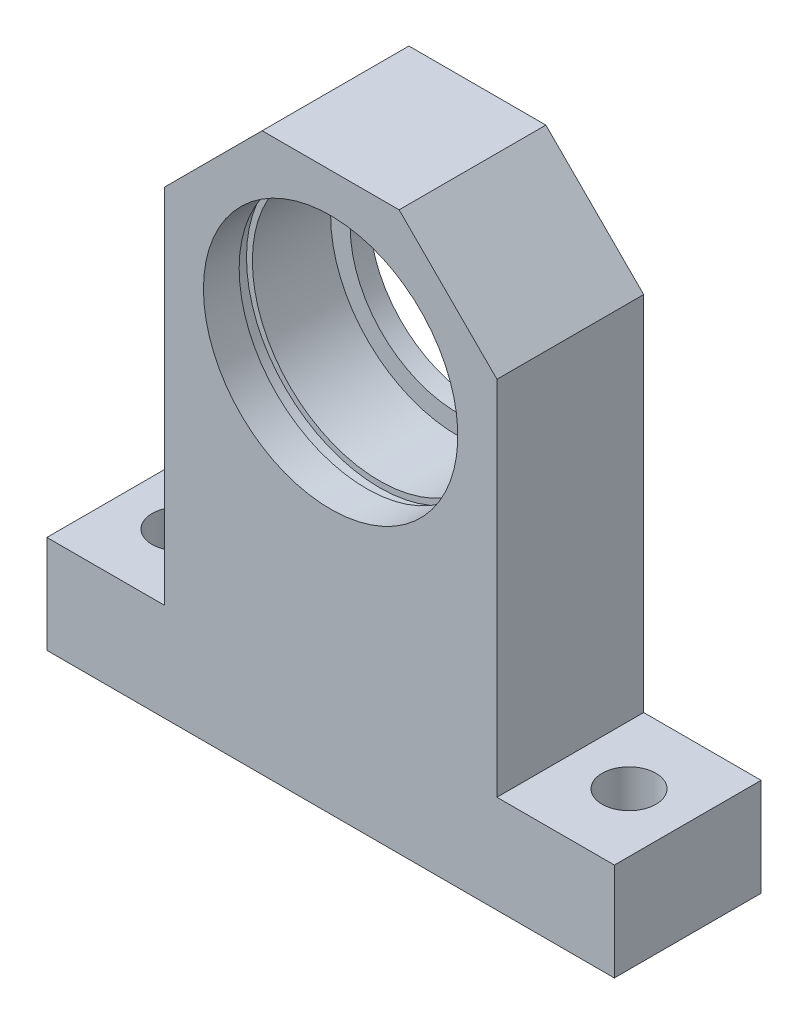
ISO-10303-21;
HEADER;
FILE_DESCRIPTION(('STEP AP214'),'2;1');
FILE_NAME('part.step','',(''),(''),'','','');
FILE_SCHEMA(('AUTOMOTIVE_DESIGN { 1 0 10303 214 1 1 1 1 }'));
ENDSEC;
DATA;
#1=APPLICATION_CONTEXT('core data for automotive mechanical design processes');
#2=APPLICATION_PROTOCOL_DEFINITION('international standard','automotive_design',2000,#1);
#3=PRODUCT_CONTEXT('',#1,'mechanical');
#4=PRODUCT('Part','Part','',(#3));
#5=PRODUCT_RELATED_PRODUCT_CATEGORY('part','',(#4));
#6=PRODUCT_DEFINITION_FORMATION('','',#4);
#7=PRODUCT_DEFINITION_CONTEXT('part definition',#1,'design');
#8=PRODUCT_DEFINITION('design','',#6,#7);
#9=PRODUCT_DEFINITION_SHAPE('','',#8);
#10=(LENGTH_UNIT() NAMED_UNIT(*) SI_UNIT(.MILLI.,.METRE.));
#11=(NAMED_UNIT(*) PLANE_ANGLE_UNIT() SI_UNIT($,.RADIAN.));
#12=(NAMED_UNIT(*) SI_UNIT($,.STERADIAN.) SOLID_ANGLE_UNIT());
#13=UNCERTAINTY_MEASURE_WITH_UNIT(LENGTH_MEASURE(1.E-05),#10,'distance_accuracy_value','');
#14=(GEOMETRIC_REPRESENTATION_CONTEXT(3) GLOBAL_UNCERTAINTY_ASSIGNED_CONTEXT((#13)) GLOBAL_UNIT_ASSIGNED_CONTEXT((#10,
#11,#12)) REPRESENTATION_CONTEXT('',''));
#15=CARTESIAN_POINT('',(0.,0.,0.));
#16=DIRECTION('',(0.,0.,1.));
#17=DIRECTION('',(1.,0.,0.));
#18=AXIS2_PLACEMENT_3D('',#15,#16,#17);
#19=CARTESIAN_POINT('',(-17.,9.99999999999999,-15.));
#20=DIRECTION('',(-1.,0.,0.));
#21=DIRECTION('',(0.,-1.,0.));
#22=AXIS2_PLACEMENT_3D('',#19,#20,#21);
#23=PLANE('',#22);
#24=DIRECTION('',(0.,-1.,0.));
#25=VECTOR('',#24,1.);
#26=CARTESIAN_POINT('',(-17.,9.99999999999999,0.));
#27=LINE('',#26,#25);
#28=CARTESIAN_POINT('',(-17.,46.9999999999999,0.));
#29=VERTEX_POINT('',#28);
#30=CARTESIAN_POINT('',(-17.,9.99999999999999,0.));
#31=VERTEX_POINT('',#30);
#32=EDGE_CURVE('E146',#29,#31,#27,.T.);
#33=ORIENTED_EDGE('',*,*,#32,.F.);
#34=DIRECTION('',(0.,0.,-1.));
#35=VECTOR('',#34,1.);
#36=CARTESIAN_POINT('',(-17.,46.9999999999999,-15.));
#37=LINE('',#36,#35);
#38=CARTESIAN_POINT('',(-17.,46.9999999999999,-15.));
#39=VERTEX_POINT('',#38);
#40=EDGE_CURVE('E11',#29,#39,#37,.T.);
#41=ORIENTED_EDGE('',*,*,#40,.T.);
#42=DIRECTION('',(0.,-1.,0.));
#43=VECTOR('',#42,1.);
#44=CARTESIAN_POINT('',(-17.,9.99999999999999,-15.));
#45=LINE('',#44,#43);
#46=CARTESIAN_POINT('',(-17.,9.99999999999999,-15.));
#47=VERTEX_POINT('',#46);
#48=EDGE_CURVE('E108',#39,#47,#45,.T.);
#49=ORIENTED_EDGE('',*,*,#48,.T.);
#50=DIRECTION('',(0.,0.,1.));
#51=VECTOR('',#50,1.);
#52=CARTESIAN_POINT('',(-17.,9.99999999999999,-15.));
#53=LINE('',#52,#51);
#54=EDGE_CURVE('E110',#47,#31,#53,.T.);
#55=ORIENTED_EDGE('',*,*,#54,.T.);
#56=EDGE_LOOP('',(#33,#41,#49,#55));
#57=FACE_BOUND('',#56,.T.);
#58=ADVANCED_FACE('F33',(#57),#23,.T.);
#59=CARTESIAN_POINT('',(-17.,57.,-15.));
#60=DIRECTION('',(0.,1.,0.));
#61=DIRECTION('',(-1.,0.,0.));
#62=AXIS2_PLACEMENT_3D('',#59,#60,#61);
#63=PLANE('',#62);
#64=DIRECTION('',(-1.,0.,0.));
#65=VECTOR('',#64,1.);
#66=CARTESIAN_POINT('',(-17.,57.,0.));
#67=LINE('',#66,#65);
#68=CARTESIAN_POINT('',(6.99999999999999,57.,0.));
#69=VERTEX_POINT('',#68);
#70=CARTESIAN_POINT('',(-6.99999999999999,57.,0.));
#71=VERTEX_POINT('',#70);
#72=EDGE_CURVE('E114',#69,#71,#67,.T.);
#73=ORIENTED_EDGE('',*,*,#72,.F.);
#74=DIRECTION('',(0.,0.,-1.));
#75=VECTOR('',#74,1.);
#76=CARTESIAN_POINT('',(6.99999999999999,57.,-15.));
#77=LINE('',#76,#75);
#78=CARTESIAN_POINT('',(6.99999999999999,57.,-15.));
#79=VERTEX_POINT('',#78);
#80=EDGE_CURVE('E186',#69,#79,#77,.T.);
#81=ORIENTED_EDGE('',*,*,#80,.T.);
#82=DIRECTION('',(-1.,0.,0.));
#83=VECTOR('',#82,1.);
#84=CARTESIAN_POINT('',(-17.,57.,-15.));
#85=LINE('',#84,#83);
#86=CARTESIAN_POINT('',(-6.99999999999999,57.,-15.));
#87=VERTEX_POINT('',#86);
#88=EDGE_CURVE('E122',#79,#87,#85,.T.);
#89=ORIENTED_EDGE('',*,*,#88,.T.);
#90=DIRECTION('',(0.,0.,1.));
#91=VECTOR('',#90,1.);
#92=CARTESIAN_POINT('',(-6.99999999999999,57.,-15.));
#93=LINE('',#92,#91);
#94=EDGE_CURVE('E183',#87,#71,#93,.T.);
#95=ORIENTED_EDGE('',*,*,#94,.T.);
#96=EDGE_LOOP('',(#73,#81,#89,#95));
#97=FACE_BOUND('',#96,.T.);
#98=ADVANCED_FACE('F202',(#97),#63,.T.);
#99=CARTESIAN_POINT('',(17.,57.,-15.));
#100=DIRECTION('',(1.,0.,0.));
#101=DIRECTION('',(0.,0.,-1.));
#102=AXIS2_PLACEMENT_3D('',#99,#100,#101);
#103=PLANE('',#102);
#104=DIRECTION('',(0.,1.,0.));
#105=VECTOR('',#104,1.);
#106=CARTESIAN_POINT('',(17.,57.,-15.));
#107=LINE('',#106,#105);
#108=CARTESIAN_POINT('',(17.,10.,-15.));
#109=VERTEX_POINT('',#108);
#110=CARTESIAN_POINT('',(17.,47.,-15.));
#111=VERTEX_POINT('',#110);
#112=EDGE_CURVE('E142',#109,#111,#107,.T.);
#113=ORIENTED_EDGE('',*,*,#112,.T.);
#114=DIRECTION('',(0.,0.,1.));
#115=VECTOR('',#114,1.);
#116=CARTESIAN_POINT('',(17.,47.,-15.));
#117=LINE('',#116,#115);
#118=CARTESIAN_POINT('',(17.,47.,0.));
#119=VERTEX_POINT('',#118);
#120=EDGE_CURVE('E169',#111,#119,#117,.T.);
#121=ORIENTED_EDGE('',*,*,#120,.T.);
#122=DIRECTION('',(0.,1.,0.));
#123=VECTOR('',#122,1.);
#124=CARTESIAN_POINT('',(17.,57.,0.));
#125=LINE('',#124,#123);
#126=CARTESIAN_POINT('',(17.,10.,0.));
#127=VERTEX_POINT('',#126);
#128=EDGE_CURVE('E162',#127,#119,#125,.T.);
#129=ORIENTED_EDGE('',*,*,#128,.F.);
#130=DIRECTION('',(0.,0.,1.));
#131=VECTOR('',#130,1.);
#132=CARTESIAN_POINT('',(17.,10.,-15.));
#133=LINE('',#132,#131);
#134=EDGE_CURVE('E167',#109,#127,#133,.T.);
#135=ORIENTED_EDGE('',*,*,#134,.F.);
#136=EDGE_LOOP('',(#113,#121,#129,#135));
#137=FACE_BOUND('',#136,.T.);
#138=ADVANCED_FACE('F195',(#137),#103,.T.);
#139=CARTESIAN_POINT('',(17.,10.,-15.));
#140=DIRECTION('',(0.,1.,0.));
#141=DIRECTION('',(-1.,0.,0.));
#142=AXIS2_PLACEMENT_3D('',#139,#140,#141);
#143=PLANE('',#142);
#144=CARTESIAN_POINT('',(23.,10.,-7.5));
#145=DIRECTION('',(0.,1.,0.));
#146=DIRECTION('',(0.,0.,1.));
#147=AXIS2_PLACEMENT_3D('',#144,#145,#146);
#148=CIRCLE('',#147,2.74999999999999);
#149=CARTESIAN_POINT('',(23.,10.,-4.75000000000001));
#150=VERTEX_POINT('',#149);
#151=EDGE_CURVE('E315',#150,#150,#148,.T.);
#152=ORIENTED_EDGE('',*,*,#151,.F.);
#153=EDGE_LOOP('',(#152));
#154=FACE_BOUND('',#153,.T.);
#155=DIRECTION('',(-1.,0.,0.));
#156=VECTOR('',#155,1.);
#157=CARTESIAN_POINT('',(17.,10.,0.));
#158=LINE('',#157,#156);
#159=CARTESIAN_POINT('',(29.,9.99999999999999,0.));
#160=VERTEX_POINT('',#159);
#161=EDGE_CURVE('E159',#160,#127,#158,.T.);
#162=ORIENTED_EDGE('',*,*,#161,.F.);
#163=DIRECTION('',(0.,0.,1.));
#164=VECTOR('',#163,1.);
#165=CARTESIAN_POINT('',(29.,9.99999999999999,-15.));
#166=LINE('',#165,#164);
#167=CARTESIAN_POINT('',(29.,9.99999999999999,-15.));
#168=VERTEX_POINT('',#167);
#169=EDGE_CURVE('E170',#168,#160,#166,.T.);
#170=ORIENTED_EDGE('',*,*,#169,.F.);
#171=DIRECTION('',(-1.,0.,0.));
#172=VECTOR('',#171,1.);
#173=CARTESIAN_POINT('',(17.,10.,-15.));
#174=LINE('',#173,#172);
#175=EDGE_CURVE('E139',#168,#109,#174,.T.);
#176=ORIENTED_EDGE('',*,*,#175,.T.);
#177=ORIENTED_EDGE('',*,*,#134,.T.);
#178=EDGE_LOOP('',(#162,#170,#176,#177));
#179=FACE_BOUND('',#178,.T.);
#180=ADVANCED_FACE('F217',(#154,#179),#143,.T.);
#181=CARTESIAN_POINT('',(29.,9.99999999999999,-15.));
#182=DIRECTION('',(1.,0.,0.));
#183=DIRECTION('',(0.,0.,-1.));
#184=AXIS2_PLACEMENT_3D('',#181,#182,#183);
#185=PLANE('',#184);
#186=DIRECTION('',(0.,1.,0.));
#187=VECTOR('',#186,1.);
#188=CARTESIAN_POINT('',(29.,9.99999999999999,0.));
#189=LINE('',#188,#187);
#190=CARTESIAN_POINT('',(29.,0.,0.));
#191=VERTEX_POINT('',#190);
#192=EDGE_CURVE('E156',#191,#160,#189,.T.);
#193=ORIENTED_EDGE('',*,*,#192,.F.);
#194=DIRECTION('',(0.,0.,1.));
#195=VECTOR('',#194,1.);
#196=CARTESIAN_POINT('',(29.,0.,-15.));
#197=LINE('',#196,#195);
#198=CARTESIAN_POINT('',(29.,0.,-15.));
#199=VERTEX_POINT('',#198);
#200=EDGE_CURVE('E172',#199,#191,#197,.T.);
#201=ORIENTED_EDGE('',*,*,#200,.F.);
#202=DIRECTION('',(0.,1.,0.));
#203=VECTOR('',#202,1.);
#204=CARTESIAN_POINT('',(29.,9.99999999999999,-15.));
#205=LINE('',#204,#203);
#206=EDGE_CURVE('E136',#199,#168,#205,.T.);
#207=ORIENTED_EDGE('',*,*,#206,.T.);
#208=ORIENTED_EDGE('',*,*,#169,.T.);
#209=EDGE_LOOP('',(#193,#201,#207,#208));
#210=FACE_BOUND('',#209,.T.);
#211=ADVANCED_FACE('F214',(#210),#185,.T.);
#212=CARTESIAN_POINT('',(29.,0.,-15.));
#213=DIRECTION('',(0.,-1.,0.));
#214=DIRECTION('',(0.,0.,-1.));
#215=AXIS2_PLACEMENT_3D('',#212,#213,#214);
#216=PLANE('',#215);
#217=CARTESIAN_POINT('',(-23.,0.,-7.5));
#218=DIRECTION('',(0.,1.,0.));
#219=DIRECTION('',(0.,0.,1.));
#220=AXIS2_PLACEMENT_3D('',#217,#218,#219);
#221=CIRCLE('',#220,2.75);
#222=CARTESIAN_POINT('',(-23.,0.,-4.75));
#223=VERTEX_POINT('',#222);
#224=EDGE_CURVE('E318',#223,#223,#221,.T.);
#225=ORIENTED_EDGE('',*,*,#224,.T.);
#226=EDGE_LOOP('',(#225));
#227=FACE_BOUND('',#226,.T.);
#228=CARTESIAN_POINT('',(23.,0.,-7.5));
#229=DIRECTION('',(0.,1.,0.));
#230=DIRECTION('',(0.,0.,1.));
#231=AXIS2_PLACEMENT_3D('',#228,#229,#230);
#232=CIRCLE('',#231,2.75);
#233=CARTESIAN_POINT('',(23.,0.,-4.75));
#234=VERTEX_POINT('',#233);
#235=EDGE_CURVE('E312',#234,#234,#232,.T.);
#236=ORIENTED_EDGE('',*,*,#235,.T.);
#237=EDGE_LOOP('',(#236));
#238=FACE_BOUND('',#237,.T.);
#239=DIRECTION('',(1.,0.,0.));
#240=VECTOR('',#239,1.);
#241=CARTESIAN_POINT('',(29.,0.,0.));
#242=LINE('',#241,#240);
#243=CARTESIAN_POINT('',(-29.,0.,0.));
#244=VERTEX_POINT('',#243);
#245=EDGE_CURVE('E153',#244,#191,#242,.T.);
#246=ORIENTED_EDGE('',*,*,#245,.F.);
#247=DIRECTION('',(0.,0.,1.));
#248=VECTOR('',#247,1.);
#249=CARTESIAN_POINT('',(-29.,0.,-15.));
#250=LINE('',#249,#248);
#251=CARTESIAN_POINT('',(-29.,0.,-15.));
#252=VERTEX_POINT('',#251);
#253=EDGE_CURVE('E174',#252,#244,#250,.T.);
#254=ORIENTED_EDGE('',*,*,#253,.F.);
#255=DIRECTION('',(1.,0.,0.));
#256=VECTOR('',#255,1.);
#257=CARTESIAN_POINT('',(29.,0.,-15.));
#258=LINE('',#257,#256);
#259=EDGE_CURVE('E130',#252,#199,#258,.T.);
#260=ORIENTED_EDGE('',*,*,#259,.T.);
#261=ORIENTED_EDGE('',*,*,#200,.T.);
#262=EDGE_LOOP('',(#246,#254,#260,#261));
#263=FACE_BOUND('',#262,.T.);
#264=ADVANCED_FACE('F210',(#227,#238,#263),#216,.T.);
#265=CARTESIAN_POINT('',(-29.,0.,-15.));
#266=DIRECTION('',(-1.,0.,0.));
#267=DIRECTION('',(0.,0.,1.));
#268=AXIS2_PLACEMENT_3D('',#265,#266,#267);
#269=PLANE('',#268);
#270=DIRECTION('',(0.,-1.,0.));
#271=VECTOR('',#270,1.);
#272=CARTESIAN_POINT('',(-29.,0.,0.));
#273=LINE('',#272,#271);
#274=CARTESIAN_POINT('',(-29.,9.99999999999999,0.));
#275=VERTEX_POINT('',#274);
#276=EDGE_CURVE('E150',#275,#244,#273,.T.);
#277=ORIENTED_EDGE('',*,*,#276,.F.);
#278=DIRECTION('',(0.,0.,1.));
#279=VECTOR('',#278,1.);
#280=CARTESIAN_POINT('',(-29.,9.99999999999999,-15.));
#281=LINE('',#280,#279);
#282=CARTESIAN_POINT('',(-29.,9.99999999999999,-15.));
#283=VERTEX_POINT('',#282);
#284=EDGE_CURVE('E121',#283,#275,#281,.T.);
#285=ORIENTED_EDGE('',*,*,#284,.F.);
#286=DIRECTION('',(0.,-1.,0.));
#287=VECTOR('',#286,1.);
#288=CARTESIAN_POINT('',(-29.,0.,-15.));
#289=LINE('',#288,#287);
#290=EDGE_CURVE('E128',#283,#252,#289,.T.);
#291=ORIENTED_EDGE('',*,*,#290,.T.);
#292=ORIENTED_EDGE('',*,*,#253,.T.);
#293=EDGE_LOOP('',(#277,#285,#291,#292));
#294=FACE_BOUND('',#293,.T.);
#295=ADVANCED_FACE('F208',(#294),#269,.T.);
#296=CARTESIAN_POINT('',(-29.,9.99999999999999,-15.));
#297=DIRECTION('',(0.,1.,0.));
#298=DIRECTION('',(0.,0.,1.));
#299=AXIS2_PLACEMENT_3D('',#296,#297,#298);
#300=PLANE('',#299);
#301=CARTESIAN_POINT('',(-23.,10.,-7.5));
#302=DIRECTION('',(0.,1.,0.));
#303=DIRECTION('',(0.,0.,1.));
#304=AXIS2_PLACEMENT_3D('',#301,#302,#303);
#305=CIRCLE('',#304,2.74999999999999);
#306=CARTESIAN_POINT('',(-23.,10.,-4.75000000000001));
#307=VERTEX_POINT('',#306);
#308=EDGE_CURVE('E321',#307,#307,#305,.T.);
#309=ORIENTED_EDGE('',*,*,#308,.F.);
#310=EDGE_LOOP('',(#309));
#311=FACE_BOUND('',#310,.T.);
#312=DIRECTION('',(-1.,0.,0.));
#313=VECTOR('',#312,1.);
#314=CARTESIAN_POINT('',(-29.,9.99999999999999,0.));
#315=LINE('',#314,#313);
#316=EDGE_CURVE('E120',#31,#275,#315,.T.);
#317=ORIENTED_EDGE('',*,*,#316,.F.);
#318=ORIENTED_EDGE('',*,*,#54,.F.);
#319=DIRECTION('',(-1.,0.,0.));
#320=VECTOR('',#319,1.);
#321=CARTESIAN_POINT('',(-29.,9.99999999999999,-15.));
#322=LINE('',#321,#320);
#323=EDGE_CURVE('E113',#47,#283,#322,.T.);
#324=ORIENTED_EDGE('',*,*,#323,.T.);
#325=ORIENTED_EDGE('',*,*,#284,.T.);
#326=EDGE_LOOP('',(#317,#318,#324,#325));
#327=FACE_BOUND('',#326,.T.);
#328=ADVANCED_FACE('F118',(#311,#327),#300,.T.);
#329=CARTESIAN_POINT('',(0.,0.,-15.));
#330=DIRECTION('',(0.,0.,-1.));
#331=DIRECTION('',(-1.,0.,0.));
#332=AXIS2_PLACEMENT_3D('',#329,#330,#331);
#333=PLANE('',#332);
#334=CARTESIAN_POINT('',(0.,40.,-15.));
#335=DIRECTION('',(0.,0.,-1.));
#336=DIRECTION('',(-1.,0.,0.));
#337=AXIS2_PLACEMENT_3D('',#334,#335,#336);
#338=CIRCLE('',#337,11.);
#339=CARTESIAN_POINT('',(-11.,40.,-15.));
#340=VERTEX_POINT('',#339);
#341=EDGE_CURVE('E290',#340,#340,#338,.T.);
#342=ORIENTED_EDGE('',*,*,#341,.F.);
#343=EDGE_LOOP('',(#342));
#344=FACE_BOUND('',#343,.T.);
#345=ORIENTED_EDGE('',*,*,#88,.F.);
#346=DIRECTION('',(-0.707106781186549,0.707106781186546,0.));
#347=VECTOR('',#346,1.);
#348=CARTESIAN_POINT('',(32.,32.0000000000001,-15.));
#349=LINE('',#348,#347);
#350=EDGE_CURVE('E41',#79,#111,#349,.F.);
#351=ORIENTED_EDGE('',*,*,#350,.T.);
#352=ORIENTED_EDGE('',*,*,#112,.F.);
#353=ORIENTED_EDGE('',*,*,#175,.F.);
#354=ORIENTED_EDGE('',*,*,#206,.F.);
#355=ORIENTED_EDGE('',*,*,#259,.F.);
#356=ORIENTED_EDGE('',*,*,#290,.F.);
#357=ORIENTED_EDGE('',*,*,#323,.F.);
#358=ORIENTED_EDGE('',*,*,#48,.F.);
#359=DIRECTION('',(-0.707106781186546,-0.707106781186549,0.));
#360=VECTOR('',#359,1.);
#361=CARTESIAN_POINT('',(-32.,31.9999999999999,-15.));
#362=LINE('',#361,#360);
#363=EDGE_CURVE('E53',#39,#87,#362,.F.);
#364=ORIENTED_EDGE('',*,*,#363,.T.);
#365=EDGE_LOOP('',(#345,#351,#352,#353,#354,#355,#356,#357,#358,#364));
#366=FACE_BOUND('',#365,.T.);
#367=ADVANCED_FACE('F125',(#344,#366),#333,.T.);
#368=CARTESIAN_POINT('',(0.,0.,0.));
#369=DIRECTION('',(0.,0.,-1.));
#370=DIRECTION('',(-1.,0.,0.));
#371=AXIS2_PLACEMENT_3D('',#368,#369,#370);
#372=PLANE('',#371);
#373=CARTESIAN_POINT('',(0.,40.,0.));
#374=DIRECTION('',(0.,0.,-1.));
#375=DIRECTION('',(-1.,0.,0.));
#376=AXIS2_PLACEMENT_3D('',#373,#374,#375);
#377=CIRCLE('',#376,13.);
#378=CARTESIAN_POINT('',(-13.,40.,0.));
#379=VERTEX_POINT('',#378);
#380=EDGE_CURVE('E148',#379,#379,#377,.T.);
#381=ORIENTED_EDGE('',*,*,#380,.T.);
#382=EDGE_LOOP('',(#381));
#383=FACE_BOUND('',#382,.T.);
#384=ORIENTED_EDGE('',*,*,#128,.T.);
#385=DIRECTION('',(0.707106781186549,-0.707106781186546,0.));
#386=VECTOR('',#385,1.);
#387=CARTESIAN_POINT('',(17.,47.,0.));
#388=LINE('',#387,#386);
#389=EDGE_CURVE('E181',#119,#69,#388,.F.);
#390=ORIENTED_EDGE('',*,*,#389,.T.);
#391=ORIENTED_EDGE('',*,*,#72,.T.);
#392=DIRECTION('',(0.707106781186546,0.707106781186549,0.));
#393=VECTOR('',#392,1.);
#394=CARTESIAN_POINT('',(-6.99999999999999,57.,0.));
#395=LINE('',#394,#393);
#396=EDGE_CURVE('E179',#71,#29,#395,.F.);
#397=ORIENTED_EDGE('',*,*,#396,.T.);
#398=ORIENTED_EDGE('',*,*,#32,.T.);
#399=ORIENTED_EDGE('',*,*,#316,.T.);
#400=ORIENTED_EDGE('',*,*,#276,.T.);
#401=ORIENTED_EDGE('',*,*,#245,.T.);
#402=ORIENTED_EDGE('',*,*,#192,.T.);
#403=ORIENTED_EDGE('',*,*,#161,.T.);
#404=EDGE_LOOP('',(#384,#390,#391,#397,#398,#399,#400,#401,#402,#403));
#405=FACE_BOUND('',#404,.T.);
#406=ADVANCED_FACE('F200',(#383,#405),#372,.F.);
#407=CARTESIAN_POINT('',(0.,40.,-15.));
#408=DIRECTION('',(0.,0.,-1.));
#409=DIRECTION('',(-1.,0.,0.));
#410=AXIS2_PLACEMENT_3D('',#407,#408,#409);
#411=CYLINDRICAL_SURFACE('',#410,13.);
#412=ORIENTED_EDGE('',*,*,#380,.F.);
#413=EDGE_LOOP('',(#412));
#414=FACE_BOUND('',#413,.T.);
#415=CARTESIAN_POINT('',(0.,40.,-3.65));
#416=DIRECTION('',(0.,0.,-1.));
#417=DIRECTION('',(-1.,0.,0.));
#418=AXIS2_PLACEMENT_3D('',#415,#416,#417);
#419=CIRCLE('',#418,13.);
#420=CARTESIAN_POINT('',(-13.,40.,-3.65));
#421=VERTEX_POINT('',#420);
#422=EDGE_CURVE('E309',#421,#421,#419,.T.);
#423=ORIENTED_EDGE('',*,*,#422,.T.);
#424=EDGE_LOOP('',(#423));
#425=FACE_BOUND('',#424,.T.);
#426=ADVANCED_FACE('F276',(#414,#425),#411,.F.);
#427=CARTESIAN_POINT('',(0.,40.,-15.));
#428=DIRECTION('',(0.,0.,-1.));
#429=DIRECTION('',(-1.,0.,0.));
#430=AXIS2_PLACEMENT_3D('',#427,#428,#429);
#431=CYLINDRICAL_SURFACE('',#430,11.);
#432=CARTESIAN_POINT('',(0.,40.,-13.));
#433=DIRECTION('',(0.,0.,-1.));
#434=DIRECTION('',(-1.,0.,0.));
#435=AXIS2_PLACEMENT_3D('',#432,#433,#434);
#436=CIRCLE('',#435,11.);
#437=CARTESIAN_POINT('',(-11.,40.,-13.));
#438=VERTEX_POINT('',#437);
#439=EDGE_CURVE('E292',#438,#438,#436,.T.);
#440=ORIENTED_EDGE('',*,*,#439,.F.);
#441=EDGE_LOOP('',(#440));
#442=FACE_BOUND('',#441,.T.);
#443=ORIENTED_EDGE('',*,*,#341,.T.);
#444=EDGE_LOOP('',(#443));
#445=FACE_BOUND('',#444,.T.);
#446=ADVANCED_FACE('F272',(#442,#445),#431,.F.);
#447=CARTESIAN_POINT('',(0.,53.,-13.));
#448=DIRECTION('',(0.,0.,-1.));
#449=DIRECTION('',(-1.,0.,0.));
#450=AXIS2_PLACEMENT_3D('',#447,#448,#449);
#451=PLANE('',#450);
#452=CARTESIAN_POINT('',(0.,40.,-13.));
#453=DIRECTION('',(0.,0.,-1.));
#454=DIRECTION('',(-1.,0.,0.));
#455=AXIS2_PLACEMENT_3D('',#452,#453,#454);
#456=CIRCLE('',#455,13.);
#457=CARTESIAN_POINT('',(-13.,40.,-13.));
#458=VERTEX_POINT('',#457);
#459=EDGE_CURVE('E297',#458,#458,#456,.T.);
#460=ORIENTED_EDGE('',*,*,#459,.F.);
#461=EDGE_LOOP('',(#460));
#462=FACE_BOUND('',#461,.T.);
#463=ORIENTED_EDGE('',*,*,#439,.T.);
#464=EDGE_LOOP('',(#463));
#465=FACE_BOUND('',#464,.T.);
#466=ADVANCED_FACE('F268',(#462,#465),#451,.F.);
#467=CARTESIAN_POINT('',(0.,40.,-15.));
#468=DIRECTION('',(0.,0.,-1.));
#469=DIRECTION('',(-1.,0.,0.));
#470=AXIS2_PLACEMENT_3D('',#467,#468,#469);
#471=CYLINDRICAL_SURFACE('',#470,13.);
#472=CARTESIAN_POINT('',(0.,40.,-5.));
#473=DIRECTION('',(0.,0.,-1.));
#474=DIRECTION('',(-1.,0.,0.));
#475=AXIS2_PLACEMENT_3D('',#472,#473,#474);
#476=CIRCLE('',#475,13.);
#477=CARTESIAN_POINT('',(-13.,40.,-5.));
#478=VERTEX_POINT('',#477);
#479=EDGE_CURVE('E300',#478,#478,#476,.T.);
#480=ORIENTED_EDGE('',*,*,#479,.F.);
#481=EDGE_LOOP('',(#480));
#482=FACE_BOUND('',#481,.T.);
#483=ORIENTED_EDGE('',*,*,#459,.T.);
#484=EDGE_LOOP('',(#483));
#485=FACE_BOUND('',#484,.T.);
#486=ADVANCED_FACE('F264',(#482,#485),#471,.F.);
#487=CARTESIAN_POINT('',(0.,53.6,-5.));
#488=DIRECTION('',(0.,0.,-1.));
#489=DIRECTION('',(-1.,0.,0.));
#490=AXIS2_PLACEMENT_3D('',#487,#488,#489);
#491=PLANE('',#490);
#492=CARTESIAN_POINT('',(0.,40.,-5.));
#493=DIRECTION('',(0.,0.,-1.));
#494=DIRECTION('',(-1.,0.,0.));
#495=AXIS2_PLACEMENT_3D('',#492,#493,#494);
#496=CIRCLE('',#495,13.6);
#497=CARTESIAN_POINT('',(-13.6,40.,-5.));
#498=VERTEX_POINT('',#497);
#499=EDGE_CURVE('E303',#498,#498,#496,.T.);
#500=ORIENTED_EDGE('',*,*,#499,.F.);
#501=EDGE_LOOP('',(#500));
#502=FACE_BOUND('',#501,.T.);
#503=ORIENTED_EDGE('',*,*,#479,.T.);
#504=EDGE_LOOP('',(#503));
#505=FACE_BOUND('',#504,.T.);
#506=ADVANCED_FACE('F260',(#502,#505),#491,.F.);
#507=CARTESIAN_POINT('',(0.,40.,-15.));
#508=DIRECTION('',(0.,0.,-1.));
#509=DIRECTION('',(-1.,0.,0.));
#510=AXIS2_PLACEMENT_3D('',#507,#508,#509);
#511=CYLINDRICAL_SURFACE('',#510,13.6);
#512=CARTESIAN_POINT('',(0.,40.,-3.65));
#513=DIRECTION('',(0.,0.,-1.));
#514=DIRECTION('',(-1.,0.,0.));
#515=AXIS2_PLACEMENT_3D('',#512,#513,#514);
#516=CIRCLE('',#515,13.6);
#517=CARTESIAN_POINT('',(-13.6,40.,-3.65));
#518=VERTEX_POINT('',#517);
#519=EDGE_CURVE('E306',#518,#518,#516,.T.);
#520=ORIENTED_EDGE('',*,*,#519,.F.);
#521=EDGE_LOOP('',(#520));
#522=FACE_BOUND('',#521,.T.);
#523=ORIENTED_EDGE('',*,*,#499,.T.);
#524=EDGE_LOOP('',(#523));
#525=FACE_BOUND('',#524,.T.);
#526=ADVANCED_FACE('F256',(#522,#525),#511,.F.);
#527=CARTESIAN_POINT('',(0.,53.,-3.65));
#528=DIRECTION('',(0.,0.,1.));
#529=DIRECTION('',(1.,0.,0.));
#530=AXIS2_PLACEMENT_3D('',#527,#528,#529);
#531=PLANE('',#530);
#532=ORIENTED_EDGE('',*,*,#422,.F.);
#533=EDGE_LOOP('',(#532));
#534=FACE_BOUND('',#533,.T.);
#535=ORIENTED_EDGE('',*,*,#519,.T.);
#536=EDGE_LOOP('',(#535));
#537=FACE_BOUND('',#536,.T.);
#538=ADVANCED_FACE('F248',(#534,#537),#531,.F.);
#539=CARTESIAN_POINT('',(23.,9.99999999999999,-7.5));
#540=DIRECTION('',(0.,1.,0.));
#541=DIRECTION('',(0.,0.,1.));
#542=AXIS2_PLACEMENT_3D('',#539,#540,#541);
#543=CYLINDRICAL_SURFACE('',#542,2.74999999999999);
#544=ORIENTED_EDGE('',*,*,#235,.F.);
#545=EDGE_LOOP('',(#544));
#546=FACE_BOUND('',#545,.T.);
#547=ORIENTED_EDGE('',*,*,#151,.T.);
#548=EDGE_LOOP('',(#547));
#549=FACE_BOUND('',#548,.T.);
#550=ADVANCED_FACE('F242',(#546,#549),#543,.F.);
#551=CARTESIAN_POINT('',(-23.,9.99999999999999,-7.5));
#552=DIRECTION('',(0.,1.,0.));
#553=DIRECTION('',(0.,0.,1.));
#554=AXIS2_PLACEMENT_3D('',#551,#552,#553);
#555=CYLINDRICAL_SURFACE('',#554,2.74999999999999);
#556=ORIENTED_EDGE('',*,*,#224,.F.);
#557=EDGE_LOOP('',(#556));
#558=FACE_BOUND('',#557,.T.);
#559=ORIENTED_EDGE('',*,*,#308,.T.);
#560=EDGE_LOOP('',(#559));
#561=FACE_BOUND('',#560,.T.);
#562=ADVANCED_FACE('F237',(#558,#561),#555,.F.);
#563=CARTESIAN_POINT('',(17.,47.,-15.));
#564=DIRECTION('',(-0.707106781186546,-0.707106781186549,0.));
#565=DIRECTION('',(0.,0.,1.));
#566=AXIS2_PLACEMENT_3D('',#563,#564,#565);
#567=PLANE('',#566);
#568=ORIENTED_EDGE('',*,*,#350,.F.);
#569=ORIENTED_EDGE('',*,*,#80,.F.);
#570=ORIENTED_EDGE('',*,*,#389,.F.);
#571=ORIENTED_EDGE('',*,*,#120,.F.);
#572=EDGE_LOOP('',(#568,#569,#570,#571));
#573=FACE_BOUND('',#572,.T.);
#574=ADVANCED_FACE('F197',(#573),#567,.F.);
#575=CARTESIAN_POINT('',(-6.99999999999999,57.,-15.));
#576=DIRECTION('',(0.707106781186549,-0.707106781186546,0.));
#577=DIRECTION('',(0.,0.,1.));
#578=AXIS2_PLACEMENT_3D('',#575,#576,#577);
#579=PLANE('',#578);
#580=ORIENTED_EDGE('',*,*,#363,.F.);
#581=ORIENTED_EDGE('',*,*,#40,.F.);
#582=ORIENTED_EDGE('',*,*,#396,.F.);
#583=ORIENTED_EDGE('',*,*,#94,.F.);
#584=EDGE_LOOP('',(#580,#581,#582,#583));
#585=FACE_BOUND('',#584,.T.);
#586=ADVANCED_FACE('F35',(#585),#579,.F.);
#587=CLOSED_SHELL('',(#58,#98,#138,#180,#211,#264,#295,#328,#367,#406,#426,#446,#466,#486,#506,
#526,#538,#550,#562,#574,#586));
#588=MANIFOLD_SOLID_BREP('B2',#587);
#589=ADVANCED_BREP_SHAPE_REPRESENTATION('',(#18,#588),#14);
#590=SHAPE_DEFINITION_REPRESENTATION(#9,#589);
ENDSEC;
END-ISO-10303-21;
